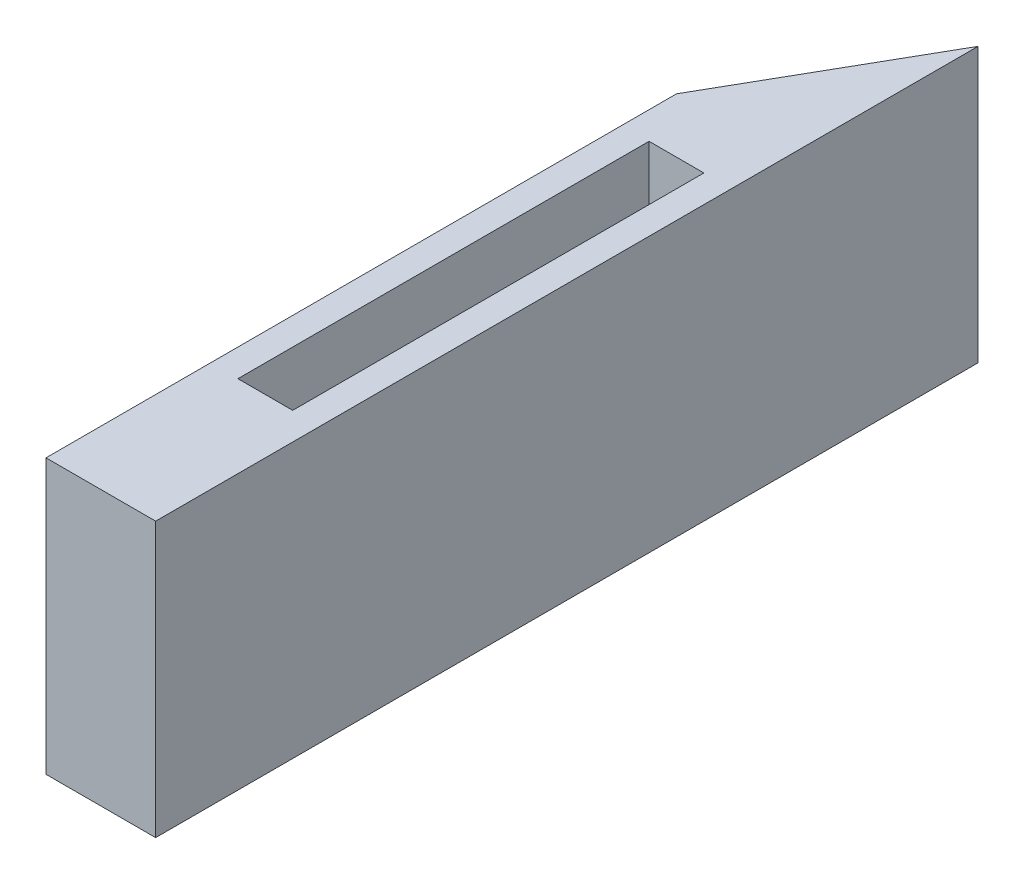
ISO-10303-21;
HEADER;
FILE_DESCRIPTION(('STEP AP214'),'2;1');
FILE_NAME('part.step','',(''),(''),'','','');
FILE_SCHEMA(('AUTOMOTIVE_DESIGN { 1 0 10303 214 1 1 1 1 }'));
ENDSEC;
DATA;
#1=APPLICATION_CONTEXT('core data for automotive mechanical design processes');
#2=APPLICATION_PROTOCOL_DEFINITION('international standard','automotive_design',2000,#1);
#3=PRODUCT_CONTEXT('',#1,'mechanical');
#4=PRODUCT('Part','Part','',(#3));
#5=PRODUCT_RELATED_PRODUCT_CATEGORY('part','',(#4));
#6=PRODUCT_DEFINITION_FORMATION('','',#4);
#7=PRODUCT_DEFINITION_CONTEXT('part definition',#1,'design');
#8=PRODUCT_DEFINITION('design','',#6,#7);
#9=PRODUCT_DEFINITION_SHAPE('','',#8);
#10=(LENGTH_UNIT() NAMED_UNIT(*) SI_UNIT(.MILLI.,.METRE.));
#11=(NAMED_UNIT(*) PLANE_ANGLE_UNIT() SI_UNIT($,.RADIAN.));
#12=(NAMED_UNIT(*) SI_UNIT($,.STERADIAN.) SOLID_ANGLE_UNIT());
#13=UNCERTAINTY_MEASURE_WITH_UNIT(LENGTH_MEASURE(1.E-05),#10,'distance_accuracy_value','');
#14=(GEOMETRIC_REPRESENTATION_CONTEXT(3) GLOBAL_UNCERTAINTY_ASSIGNED_CONTEXT((#13)) GLOBAL_UNIT_ASSIGNED_CONTEXT((#10,
#11,#12)) REPRESENTATION_CONTEXT('',''));
#15=CARTESIAN_POINT('',(0.,0.,0.));
#16=DIRECTION('',(0.,0.,1.));
#17=DIRECTION('',(1.,0.,0.));
#18=AXIS2_PLACEMENT_3D('',#15,#16,#17);
#19=CARTESIAN_POINT('',(4.,0.,0.));
#20=DIRECTION('',(0.,0.,-1.));
#21=DIRECTION('',(-1.,0.,0.));
#22=AXIS2_PLACEMENT_3D('',#19,#20,#21);
#23=PLANE('',#22);
#24=DIRECTION('',(0.,-1.,0.));
#25=VECTOR('',#24,1.);
#26=CARTESIAN_POINT('',(0.,0.,0.));
#27=LINE('',#26,#25);
#28=CARTESIAN_POINT('',(0.,10.,0.));
#29=VERTEX_POINT('',#28);
#30=CARTESIAN_POINT('',(0.,0.,0.));
#31=VERTEX_POINT('',#30);
#32=EDGE_CURVE('E134',#29,#31,#27,.T.);
#33=ORIENTED_EDGE('',*,*,#32,.T.);
#34=DIRECTION('',(-1.,0.,0.));
#35=VECTOR('',#34,1.);
#36=CARTESIAN_POINT('',(4.,0.,0.));
#37=LINE('',#36,#35);
#38=CARTESIAN_POINT('',(4.,0.,0.));
#39=VERTEX_POINT('',#38);
#40=EDGE_CURVE('E11',#39,#31,#37,.T.);
#41=ORIENTED_EDGE('',*,*,#40,.F.);
#42=DIRECTION('',(0.,-1.,0.));
#43=VECTOR('',#42,1.);
#44=CARTESIAN_POINT('',(4.,0.,0.));
#45=LINE('',#44,#43);
#46=CARTESIAN_POINT('',(4.,10.,0.));
#47=VERTEX_POINT('',#46);
#48=EDGE_CURVE('E123',#47,#39,#45,.T.);
#49=ORIENTED_EDGE('',*,*,#48,.F.);
#50=DIRECTION('',(-1.,0.,0.));
#51=VECTOR('',#50,1.);
#52=CARTESIAN_POINT('',(4.,10.,0.));
#53=LINE('',#52,#51);
#54=EDGE_CURVE('E47',#47,#29,#53,.T.);
#55=ORIENTED_EDGE('',*,*,#54,.T.);
#56=EDGE_LOOP('',(#33,#41,#49,#55));
#57=FACE_BOUND('',#56,.T.);
#58=ADVANCED_FACE('F39',(#57),#23,.F.);
#59=CARTESIAN_POINT('',(4.,0.,0.));
#60=DIRECTION('',(0.,1.,0.));
#61=DIRECTION('',(0.,0.,1.));
#62=AXIS2_PLACEMENT_3D('',#59,#60,#61);
#63=PLANE('',#62);
#64=DIRECTION('',(-1.,0.,0.));
#65=VECTOR('',#64,1.);
#66=CARTESIAN_POINT('',(3.,0.,-21.));
#67=LINE('',#66,#65);
#68=CARTESIAN_POINT('',(3.,0.,-21.));
#69=VERTEX_POINT('',#68);
#70=CARTESIAN_POINT('',(1.,0.,-21.));
#71=VERTEX_POINT('',#70);
#72=EDGE_CURVE('E170',#69,#71,#67,.T.);
#73=ORIENTED_EDGE('',*,*,#72,.T.);
#74=DIRECTION('',(0.,0.,1.));
#75=VECTOR('',#74,1.);
#76=CARTESIAN_POINT('',(1.,0.,-6.));
#77=LINE('',#76,#75);
#78=CARTESIAN_POINT('',(1.,0.,-6.));
#79=VERTEX_POINT('',#78);
#80=EDGE_CURVE('E159',#71,#79,#77,.T.);
#81=ORIENTED_EDGE('',*,*,#80,.T.);
#82=DIRECTION('',(1.,0.,0.));
#83=VECTOR('',#82,1.);
#84=CARTESIAN_POINT('',(3.,0.,-6.));
#85=LINE('',#84,#83);
#86=CARTESIAN_POINT('',(3.,0.,-6.));
#87=VERTEX_POINT('',#86);
#88=EDGE_CURVE('E163',#79,#87,#85,.T.);
#89=ORIENTED_EDGE('',*,*,#88,.T.);
#90=DIRECTION('',(0.,0.,-1.));
#91=VECTOR('',#90,1.);
#92=CARTESIAN_POINT('',(3.,0.,-6.));
#93=LINE('',#92,#91);
#94=EDGE_CURVE('E62',#87,#69,#93,.T.);
#95=ORIENTED_EDGE('',*,*,#94,.T.);
#96=EDGE_LOOP('',(#73,#81,#89,#95));
#97=FACE_BOUND('',#96,.T.);
#98=DIRECTION('',(0.,0.,-1.));
#99=VECTOR('',#98,1.);
#100=CARTESIAN_POINT('',(0.,0.,0.));
#101=LINE('',#100,#99);
#102=CARTESIAN_POINT('',(0.,0.,-23.));
#103=VERTEX_POINT('',#102);
#104=EDGE_CURVE('E117',#31,#103,#101,.T.);
#105=ORIENTED_EDGE('',*,*,#104,.T.);
#106=DIRECTION('',(0.496138938356834,0.,-0.868243142124459));
#107=VECTOR('',#106,1.);
#108=CARTESIAN_POINT('',(0.,0.,-23.));
#109=LINE('',#108,#107);
#110=CARTESIAN_POINT('',(4.,0.,-30.));
#111=VERTEX_POINT('',#110);
#112=EDGE_CURVE('E54',#103,#111,#109,.T.);
#113=ORIENTED_EDGE('',*,*,#112,.T.);
#114=DIRECTION('',(0.,0.,-1.));
#115=VECTOR('',#114,1.);
#116=CARTESIAN_POINT('',(4.,0.,0.));
#117=LINE('',#116,#115);
#118=EDGE_CURVE('E111',#39,#111,#117,.T.);
#119=ORIENTED_EDGE('',*,*,#118,.F.);
#120=ORIENTED_EDGE('',*,*,#40,.T.);
#121=EDGE_LOOP('',(#105,#113,#119,#120));
#122=FACE_BOUND('',#121,.T.);
#123=ADVANCED_FACE('F115',(#97,#122),#63,.F.);
#124=CARTESIAN_POINT('',(4.,10.,0.));
#125=DIRECTION('',(0.,-1.,0.));
#126=DIRECTION('',(0.,0.,-1.));
#127=AXIS2_PLACEMENT_3D('',#124,#125,#126);
#128=PLANE('',#127);
#129=DIRECTION('',(1.,0.,0.));
#130=VECTOR('',#129,1.);
#131=CARTESIAN_POINT('',(3.,10.,-6.));
#132=LINE('',#131,#130);
#133=CARTESIAN_POINT('',(1.,10.,-6.));
#134=VERTEX_POINT('',#133);
#135=CARTESIAN_POINT('',(3.,10.,-6.));
#136=VERTEX_POINT('',#135);
#137=EDGE_CURVE('E155',#134,#136,#132,.T.);
#138=ORIENTED_EDGE('',*,*,#137,.F.);
#139=DIRECTION('',(0.,0.,1.));
#140=VECTOR('',#139,1.);
#141=CARTESIAN_POINT('',(1.,10.,-6.));
#142=LINE('',#141,#140);
#143=CARTESIAN_POINT('',(1.,10.,-21.));
#144=VERTEX_POINT('',#143);
#145=EDGE_CURVE('E152',#144,#134,#142,.T.);
#146=ORIENTED_EDGE('',*,*,#145,.F.);
#147=DIRECTION('',(-1.,0.,0.));
#148=VECTOR('',#147,1.);
#149=CARTESIAN_POINT('',(3.,10.,-21.));
#150=LINE('',#149,#148);
#151=CARTESIAN_POINT('',(3.,10.,-21.));
#152=VERTEX_POINT('',#151);
#153=EDGE_CURVE('E164',#152,#144,#150,.T.);
#154=ORIENTED_EDGE('',*,*,#153,.F.);
#155=DIRECTION('',(0.,0.,-1.));
#156=VECTOR('',#155,1.);
#157=CARTESIAN_POINT('',(3.,10.,-6.));
#158=LINE('',#157,#156);
#159=EDGE_CURVE('E178',#136,#152,#158,.T.);
#160=ORIENTED_EDGE('',*,*,#159,.F.);
#161=EDGE_LOOP('',(#138,#146,#154,#160));
#162=FACE_BOUND('',#161,.T.);
#163=DIRECTION('',(0.,0.,1.));
#164=VECTOR('',#163,1.);
#165=CARTESIAN_POINT('',(4.,10.,0.));
#166=LINE('',#165,#164);
#167=CARTESIAN_POINT('',(4.,10.,-30.));
#168=VERTEX_POINT('',#167);
#169=EDGE_CURVE('E110',#168,#47,#166,.T.);
#170=ORIENTED_EDGE('',*,*,#169,.F.);
#171=DIRECTION('',(0.496138938356834,0.,-0.868243142124459));
#172=VECTOR('',#171,1.);
#173=CARTESIAN_POINT('',(0.,10.,-23.));
#174=LINE('',#173,#172);
#175=CARTESIAN_POINT('',(0.,10.,-23.));
#176=VERTEX_POINT('',#175);
#177=EDGE_CURVE('E105',#176,#168,#174,.T.);
#178=ORIENTED_EDGE('',*,*,#177,.F.);
#179=DIRECTION('',(0.,0.,1.));
#180=VECTOR('',#179,1.);
#181=CARTESIAN_POINT('',(0.,10.,0.));
#182=LINE('',#181,#180);
#183=EDGE_CURVE('E128',#176,#29,#182,.T.);
#184=ORIENTED_EDGE('',*,*,#183,.T.);
#185=ORIENTED_EDGE('',*,*,#54,.F.);
#186=EDGE_LOOP('',(#170,#178,#184,#185));
#187=FACE_BOUND('',#186,.T.);
#188=ADVANCED_FACE('F203',(#162,#187),#128,.F.);
#189=CARTESIAN_POINT('',(4.,0.,0.));
#190=DIRECTION('',(-1.,0.,0.));
#191=DIRECTION('',(0.,0.,1.));
#192=AXIS2_PLACEMENT_3D('',#189,#190,#191);
#193=PLANE('',#192);
#194=ORIENTED_EDGE('',*,*,#48,.T.);
#195=ORIENTED_EDGE('',*,*,#118,.T.);
#196=DIRECTION('',(0.,1.,0.));
#197=VECTOR('',#196,1.);
#198=CARTESIAN_POINT('',(4.,0.,-30.));
#199=LINE('',#198,#197);
#200=EDGE_CURVE('E102',#111,#168,#199,.T.);
#201=ORIENTED_EDGE('',*,*,#200,.T.);
#202=ORIENTED_EDGE('',*,*,#169,.T.);
#203=EDGE_LOOP('',(#194,#195,#201,#202));
#204=FACE_BOUND('',#203,.T.);
#205=ADVANCED_FACE('F121',(#204),#193,.F.);
#206=CARTESIAN_POINT('',(0.,0.,0.));
#207=DIRECTION('',(-1.,0.,0.));
#208=DIRECTION('',(0.,0.,1.));
#209=AXIS2_PLACEMENT_3D('',#206,#207,#208);
#210=PLANE('',#209);
#211=DIRECTION('',(0.,1.,0.));
#212=VECTOR('',#211,1.);
#213=CARTESIAN_POINT('',(0.,0.,-23.));
#214=LINE('',#213,#212);
#215=EDGE_CURVE('E119',#103,#176,#214,.T.);
#216=ORIENTED_EDGE('',*,*,#215,.F.);
#217=ORIENTED_EDGE('',*,*,#104,.F.);
#218=ORIENTED_EDGE('',*,*,#32,.F.);
#219=ORIENTED_EDGE('',*,*,#183,.F.);
#220=EDGE_LOOP('',(#216,#217,#218,#219));
#221=FACE_BOUND('',#220,.T.);
#222=ADVANCED_FACE('F150',(#221),#210,.T.);
#223=CARTESIAN_POINT('',(1.,0.,-6.));
#224=DIRECTION('',(-1.,0.,0.));
#225=DIRECTION('',(0.,0.,1.));
#226=AXIS2_PLACEMENT_3D('',#223,#224,#225);
#227=PLANE('',#226);
#228=ORIENTED_EDGE('',*,*,#145,.T.);
#229=DIRECTION('',(0.,1.,0.));
#230=VECTOR('',#229,1.);
#231=CARTESIAN_POINT('',(1.,0.,-6.));
#232=LINE('',#231,#230);
#233=EDGE_CURVE('E173',#79,#134,#232,.T.);
#234=ORIENTED_EDGE('',*,*,#233,.F.);
#235=ORIENTED_EDGE('',*,*,#80,.F.);
#236=DIRECTION('',(0.,1.,0.));
#237=VECTOR('',#236,1.);
#238=CARTESIAN_POINT('',(1.,0.,-21.));
#239=LINE('',#238,#237);
#240=EDGE_CURVE('E138',#71,#144,#239,.T.);
#241=ORIENTED_EDGE('',*,*,#240,.T.);
#242=EDGE_LOOP('',(#228,#234,#235,#241));
#243=FACE_BOUND('',#242,.T.);
#244=ADVANCED_FACE('F208',(#243),#227,.F.);
#245=CARTESIAN_POINT('',(3.,0.,-21.));
#246=DIRECTION('',(0.,0.,-1.));
#247=DIRECTION('',(-1.,0.,0.));
#248=AXIS2_PLACEMENT_3D('',#245,#246,#247);
#249=PLANE('',#248);
#250=ORIENTED_EDGE('',*,*,#153,.T.);
#251=ORIENTED_EDGE('',*,*,#240,.F.);
#252=ORIENTED_EDGE('',*,*,#72,.F.);
#253=DIRECTION('',(0.,1.,0.));
#254=VECTOR('',#253,1.);
#255=CARTESIAN_POINT('',(3.,0.,-21.));
#256=LINE('',#255,#254);
#257=EDGE_CURVE('E187',#69,#152,#256,.T.);
#258=ORIENTED_EDGE('',*,*,#257,.T.);
#259=EDGE_LOOP('',(#250,#251,#252,#258));
#260=FACE_BOUND('',#259,.T.);
#261=ADVANCED_FACE('F210',(#260),#249,.F.);
#262=CARTESIAN_POINT('',(3.,0.,-6.));
#263=DIRECTION('',(1.,0.,0.));
#264=DIRECTION('',(0.,0.,-1.));
#265=AXIS2_PLACEMENT_3D('',#262,#263,#264);
#266=PLANE('',#265);
#267=ORIENTED_EDGE('',*,*,#159,.T.);
#268=ORIENTED_EDGE('',*,*,#257,.F.);
#269=ORIENTED_EDGE('',*,*,#94,.F.);
#270=DIRECTION('',(0.,1.,0.));
#271=VECTOR('',#270,1.);
#272=CARTESIAN_POINT('',(3.,0.,-6.));
#273=LINE('',#272,#271);
#274=EDGE_CURVE('E190',#87,#136,#273,.T.);
#275=ORIENTED_EDGE('',*,*,#274,.T.);
#276=EDGE_LOOP('',(#267,#268,#269,#275));
#277=FACE_BOUND('',#276,.T.);
#278=ADVANCED_FACE('F205',(#277),#266,.F.);
#279=CARTESIAN_POINT('',(3.,0.,-6.));
#280=DIRECTION('',(0.,0.,1.));
#281=DIRECTION('',(1.,0.,0.));
#282=AXIS2_PLACEMENT_3D('',#279,#280,#281);
#283=PLANE('',#282);
#284=ORIENTED_EDGE('',*,*,#137,.T.);
#285=ORIENTED_EDGE('',*,*,#274,.F.);
#286=ORIENTED_EDGE('',*,*,#88,.F.);
#287=ORIENTED_EDGE('',*,*,#233,.T.);
#288=EDGE_LOOP('',(#284,#285,#286,#287));
#289=FACE_BOUND('',#288,.T.);
#290=ADVANCED_FACE('F197',(#289),#283,.F.);
#291=CARTESIAN_POINT('',(0.,0.,-23.));
#292=DIRECTION('',(0.868243142124459,0.,0.496138938356834));
#293=DIRECTION('',(0.496138938356834,0.,-0.868243142124459));
#294=AXIS2_PLACEMENT_3D('',#291,#292,#293);
#295=PLANE('',#294);
#296=ORIENTED_EDGE('',*,*,#177,.T.);
#297=ORIENTED_EDGE('',*,*,#200,.F.);
#298=ORIENTED_EDGE('',*,*,#112,.F.);
#299=ORIENTED_EDGE('',*,*,#215,.T.);
#300=EDGE_LOOP('',(#296,#297,#298,#299));
#301=FACE_BOUND('',#300,.T.);
#302=ADVANCED_FACE('F103',(#301),#295,.F.);
#303=CLOSED_SHELL('',(#58,#123,#188,#205,#222,#244,#261,#278,#290,#302));
#304=MANIFOLD_SOLID_BREP('B2',#303);
#305=ADVANCED_BREP_SHAPE_REPRESENTATION('',(#18,#304),#14);
#306=SHAPE_DEFINITION_REPRESENTATION(#9,#305);
ENDSEC;
END-ISO-10303-21;
